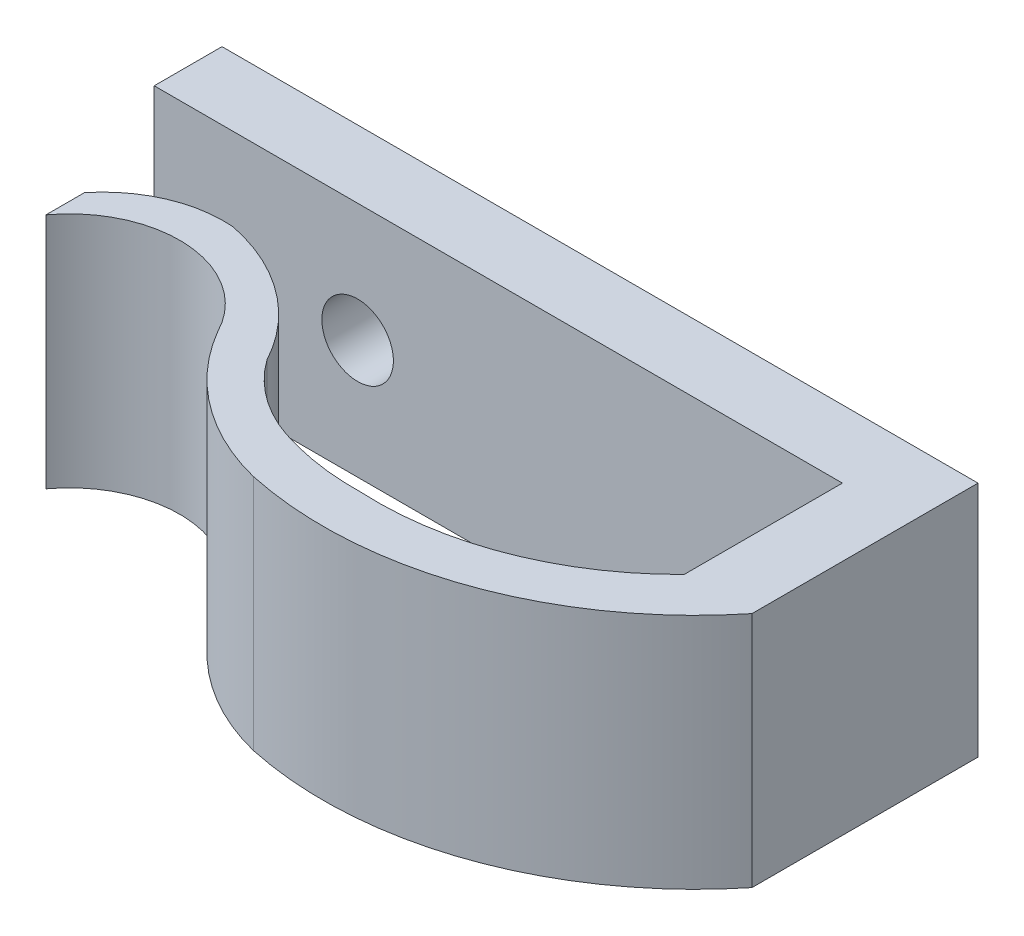
ISO-10303-21;
HEADER;
FILE_DESCRIPTION(('STEP AP214'),'2;1');
FILE_NAME('part.step','',(''),(''),'','','');
FILE_SCHEMA(('AUTOMOTIVE_DESIGN { 1 0 10303 214 1 1 1 1 }'));
ENDSEC;
DATA;
#1=APPLICATION_CONTEXT('core data for automotive mechanical design processes');
#2=APPLICATION_PROTOCOL_DEFINITION('international standard','automotive_design',2000,#1);
#3=PRODUCT_CONTEXT('',#1,'mechanical');
#4=PRODUCT('Part','Part','',(#3));
#5=PRODUCT_RELATED_PRODUCT_CATEGORY('part','',(#4));
#6=PRODUCT_DEFINITION_FORMATION('','',#4);
#7=PRODUCT_DEFINITION_CONTEXT('part definition',#1,'design');
#8=PRODUCT_DEFINITION('design','',#6,#7);
#9=PRODUCT_DEFINITION_SHAPE('','',#8);
#10=(LENGTH_UNIT() NAMED_UNIT(*) SI_UNIT(.MILLI.,.METRE.));
#11=(NAMED_UNIT(*) PLANE_ANGLE_UNIT() SI_UNIT($,.RADIAN.));
#12=(NAMED_UNIT(*) SI_UNIT($,.STERADIAN.) SOLID_ANGLE_UNIT());
#13=UNCERTAINTY_MEASURE_WITH_UNIT(LENGTH_MEASURE(1.E-05),#10,'distance_accuracy_value','');
#14=(GEOMETRIC_REPRESENTATION_CONTEXT(3) GLOBAL_UNCERTAINTY_ASSIGNED_CONTEXT((#13)) GLOBAL_UNIT_ASSIGNED_CONTEXT((#10,
#11,#12)) REPRESENTATION_CONTEXT('',''));
#15=CARTESIAN_POINT('',(0.,0.,0.));
#16=DIRECTION('',(0.,0.,1.));
#17=DIRECTION('',(1.,0.,0.));
#18=AXIS2_PLACEMENT_3D('',#15,#16,#17);
#19=CARTESIAN_POINT('',(0.,0.,3.));
#20=DIRECTION('',(0.,0.,-1.));
#21=DIRECTION('',(-1.,0.,0.));
#22=AXIS2_PLACEMENT_3D('',#19,#20,#21);
#23=PLANE('',#22);
#24=CARTESIAN_POINT('',(9.,5.25,3.));
#25=DIRECTION('',(0.,0.,-1.));
#26=DIRECTION('',(-1.,0.,0.));
#27=AXIS2_PLACEMENT_3D('',#24,#25,#26);
#28=CIRCLE('',#27,1.5825);
#29=CARTESIAN_POINT('',(7.4175,5.25,3.));
#30=VERTEX_POINT('',#29);
#31=EDGE_CURVE('E187',#30,#30,#28,.F.);
#32=ORIENTED_EDGE('',*,*,#31,.F.);
#33=EDGE_LOOP('',(#32));
#34=FACE_BOUND('',#33,.T.);
#35=DIRECTION('',(0.,-1.,0.));
#36=VECTOR('',#35,1.);
#37=CARTESIAN_POINT('',(30.45,44.0789478894117,3.));
#38=LINE('',#37,#36);
#39=CARTESIAN_POINT('',(30.45,10.5,3.));
#40=VERTEX_POINT('',#39);
#41=CARTESIAN_POINT('',(30.45,0.,3.));
#42=VERTEX_POINT('',#41);
#43=EDGE_CURVE('E50',#40,#42,#38,.T.);
#44=ORIENTED_EDGE('',*,*,#43,.F.);
#45=DIRECTION('',(-1.,0.,0.));
#46=VECTOR('',#45,1.);
#47=CARTESIAN_POINT('',(0.,10.5,3.));
#48=LINE('',#47,#46);
#49=CARTESIAN_POINT('',(0.,10.5,3.));
#50=VERTEX_POINT('',#49);
#51=EDGE_CURVE('E55',#40,#50,#48,.T.);
#52=ORIENTED_EDGE('',*,*,#51,.T.);
#53=DIRECTION('',(0.,-1.,0.));
#54=VECTOR('',#53,1.);
#55=CARTESIAN_POINT('',(0.,0.,3.));
#56=LINE('',#55,#54);
#57=CARTESIAN_POINT('',(0.,0.,3.));
#58=VERTEX_POINT('',#57);
#59=EDGE_CURVE('E86',#50,#58,#56,.T.);
#60=ORIENTED_EDGE('',*,*,#59,.T.);
#61=DIRECTION('',(1.,0.,0.));
#62=VECTOR('',#61,1.);
#63=CARTESIAN_POINT('',(0.,0.,3.));
#64=LINE('',#63,#62);
#65=EDGE_CURVE('E109',#58,#42,#64,.T.);
#66=ORIENTED_EDGE('',*,*,#65,.T.);
#67=EDGE_LOOP('',(#44,#52,#60,#66));
#68=FACE_BOUND('',#67,.T.);
#69=ADVANCED_FACE('F33',(#34,#68),#23,.F.);
#70=CARTESIAN_POINT('',(0.,0.,3.));
#71=DIRECTION('',(1.,0.,0.));
#72=DIRECTION('',(0.,0.,-1.));
#73=AXIS2_PLACEMENT_3D('',#70,#71,#72);
#74=PLANE('',#73);
#75=DIRECTION('',(0.,-1.,0.));
#76=VECTOR('',#75,1.);
#77=CARTESIAN_POINT('',(0.,0.,0.));
#78=LINE('',#77,#76);
#79=CARTESIAN_POINT('',(0.,10.5,0.));
#80=VERTEX_POINT('',#79);
#81=CARTESIAN_POINT('',(0.,0.,0.));
#82=VERTEX_POINT('',#81);
#83=EDGE_CURVE('E92',#80,#82,#78,.T.);
#84=ORIENTED_EDGE('',*,*,#83,.T.);
#85=DIRECTION('',(0.,0.,-1.));
#86=VECTOR('',#85,1.);
#87=CARTESIAN_POINT('',(0.,0.,3.));
#88=LINE('',#87,#86);
#89=EDGE_CURVE('E11',#58,#82,#88,.T.);
#90=ORIENTED_EDGE('',*,*,#89,.F.);
#91=ORIENTED_EDGE('',*,*,#59,.F.);
#92=DIRECTION('',(0.,0.,-1.));
#93=VECTOR('',#92,1.);
#94=CARTESIAN_POINT('',(0.,10.5,3.));
#95=LINE('',#94,#93);
#96=EDGE_CURVE('E78',#50,#80,#95,.T.);
#97=ORIENTED_EDGE('',*,*,#96,.T.);
#98=EDGE_LOOP('',(#84,#90,#91,#97));
#99=FACE_BOUND('',#98,.T.);
#100=ADVANCED_FACE('F35',(#99),#74,.F.);
#101=CARTESIAN_POINT('',(0.,0.,3.));
#102=DIRECTION('',(0.,1.,0.));
#103=DIRECTION('',(0.,0.,1.));
#104=AXIS2_PLACEMENT_3D('',#101,#102,#103);
#105=PLANE('',#104);
#106=DIRECTION('',(1.,0.,0.));
#107=VECTOR('',#106,1.);
#108=CARTESIAN_POINT('',(0.,0.,0.));
#109=LINE('',#108,#107);
#110=CARTESIAN_POINT('',(33.45,0.,0.));
#111=VERTEX_POINT('',#110);
#112=EDGE_CURVE('E95',#82,#111,#109,.T.);
#113=ORIENTED_EDGE('',*,*,#112,.T.);
#114=DIRECTION('',(0.,0.,-1.));
#115=VECTOR('',#114,1.);
#116=CARTESIAN_POINT('',(33.45,0.,3.));
#117=LINE('',#116,#115);
#118=CARTESIAN_POINT('',(33.45,0.,10.));
#119=VERTEX_POINT('',#118);
#120=EDGE_CURVE('E42',#119,#111,#117,.T.);
#121=ORIENTED_EDGE('',*,*,#120,.F.);
#122=CARTESIAN_POINT('',(20.6221159544795,0.,-0.315248646860587));
#123=DIRECTION('',(0.,-1.,0.));
#124=DIRECTION('',(0.,0.,1.));
#125=AXIS2_PLACEMENT_3D('',#122,#123,#124);
#126=CIRCLE('',#125,16.4608311980859);
#127=CARTESIAN_POINT('',(17.1672552114183,0.,15.7789397756084));
#128=VERTEX_POINT('',#127);
#129=EDGE_CURVE('E184',#119,#128,#126,.T.);
#130=ORIENTED_EDGE('',*,*,#129,.T.);
#131=CARTESIAN_POINT('',(19.6516591254384,0.,5.86713389302404));
#132=DIRECTION('',(0.,-1.,0.));
#133=DIRECTION('',(0.,0.,1.));
#134=AXIS2_PLACEMENT_3D('',#131,#132,#133);
#135=CIRCLE('',#134,10.2184225133839);
#136=CARTESIAN_POINT('',(10.8227065112487,0.,11.011621661347));
#137=VERTEX_POINT('',#136);
#138=EDGE_CURVE('E181',#128,#137,#135,.T.);
#139=ORIENTED_EDGE('',*,*,#138,.T.);
#140=CARTESIAN_POINT('',(6.47932166353078,0.,13.2291650625122));
#141=DIRECTION('',(0.,1.,0.));
#142=DIRECTION('',(0.,0.,-1.));
#143=AXIS2_PLACEMENT_3D('',#140,#141,#142);
#144=CIRCLE('',#143,4.8767295056664);
#145=CARTESIAN_POINT('',(2.55114240382426,0.,10.3391999459323));
#146=VERTEX_POINT('',#145);
#147=EDGE_CURVE('E178',#137,#146,#144,.T.);
#148=ORIENTED_EDGE('',*,*,#147,.T.);
#149=DIRECTION('',(0.,0.,-1.));
#150=VECTOR('',#149,1.);
#151=CARTESIAN_POINT('',(2.55114240382426,0.,8.63919994593232));
#152=LINE('',#151,#150);
#153=CARTESIAN_POINT('',(2.55114240382426,0.,8.63919994593232));
#154=VERTEX_POINT('',#153);
#155=EDGE_CURVE('E175',#146,#154,#152,.T.);
#156=ORIENTED_EDGE('',*,*,#155,.T.);
#157=CARTESIAN_POINT('',(6.72229219411145,0.,11.9958869329718));
#158=DIRECTION('',(0.,-1.,0.));
#159=DIRECTION('',(0.,0.,1.));
#160=AXIS2_PLACEMENT_3D('',#157,#158,#159);
#161=CIRCLE('',#160,5.35404875790023);
#162=CARTESIAN_POINT('',(7.14595265795709,0.,6.65862640781967));
#163=VERTEX_POINT('',#162);
#164=EDGE_CURVE('E172',#154,#163,#161,.T.);
#165=ORIENTED_EDGE('',*,*,#164,.T.);
#166=CARTESIAN_POINT('',(5.45521227568022,0.,15.0432902360127));
#167=DIRECTION('',(0.,-1.,0.));
#168=DIRECTION('',(0.,0.,-1.));
#169=AXIS2_PLACEMENT_3D('',#166,#167,#168);
#170=CIRCLE('',#169,8.55343150741679);
#171=CARTESIAN_POINT('',(12.9988744537025,0.,11.011621661347));
#172=VERTEX_POINT('',#171);
#173=EDGE_CURVE('E167',#163,#172,#170,.T.);
#174=ORIENTED_EDGE('',*,*,#173,.T.);
#175=CARTESIAN_POINT('',(18.4056741869957,0.,7.11561574984572));
#176=DIRECTION('',(0.,1.,0.));
#177=DIRECTION('',(0.,0.,1.));
#178=AXIS2_PLACEMENT_3D('',#175,#176,#177);
#179=CIRCLE('',#178,6.66425880487787);
#180=CARTESIAN_POINT('',(16.2592047181273,0.,13.4247372606115));
#181=VERTEX_POINT('',#180);
#182=EDGE_CURVE('E163',#172,#181,#179,.T.);
#183=ORIENTED_EDGE('',*,*,#182,.T.);
#184=CARTESIAN_POINT('',(19.8885488525217,0.,2.33177145979925));
#185=DIRECTION('',(0.,1.,0.));
#186=DIRECTION('',(0.,0.,1.));
#187=AXIS2_PLACEMENT_3D('',#184,#185,#186);
#188=CIRCLE('',#187,11.6715906843863);
#189=CARTESIAN_POINT('',(20.1686771043971,0.,14.));
#190=VERTEX_POINT('',#189);
#191=EDGE_CURVE('E159',#181,#190,#188,.T.);
#192=ORIENTED_EDGE('',*,*,#191,.T.);
#193=CARTESIAN_POINT('',(20.8749114107498,0.,0.602055675435018));
#194=DIRECTION('',(0.,1.,0.));
#195=DIRECTION('',(0.,0.,1.));
#196=AXIS2_PLACEMENT_3D('',#193,#194,#195);
#197=CIRCLE('',#196,13.4165449732639);
#198=CARTESIAN_POINT('',(30.45,0.,10.));
#199=VERTEX_POINT('',#198);
#200=EDGE_CURVE('E148',#190,#199,#197,.T.);
#201=ORIENTED_EDGE('',*,*,#200,.T.);
#202=DIRECTION('',(0.,0.,-1.));
#203=VECTOR('',#202,1.);
#204=CARTESIAN_POINT('',(30.45,0.,3.));
#205=LINE('',#204,#203);
#206=EDGE_CURVE('E119',#199,#42,#205,.T.);
#207=ORIENTED_EDGE('',*,*,#206,.T.);
#208=ORIENTED_EDGE('',*,*,#65,.F.);
#209=ORIENTED_EDGE('',*,*,#89,.T.);
#210=EDGE_LOOP('',(#113,#121,#130,#139,#148,#156,#165,#174,#183,#192,#201,#207,#208,#209));
#211=FACE_BOUND('',#210,.T.);
#212=ADVANCED_FACE('F225',(#211),#105,.F.);
#213=CARTESIAN_POINT('',(33.45,0.,3.));
#214=DIRECTION('',(-1.,0.,0.));
#215=DIRECTION('',(0.,0.,1.));
#216=AXIS2_PLACEMENT_3D('',#213,#214,#215);
#217=PLANE('',#216);
#218=DIRECTION('',(0.,1.,0.));
#219=VECTOR('',#218,1.);
#220=CARTESIAN_POINT('',(33.45,0.,0.));
#221=LINE('',#220,#219);
#222=CARTESIAN_POINT('',(33.45,10.5,0.));
#223=VERTEX_POINT('',#222);
#224=EDGE_CURVE('E87',#111,#223,#221,.T.);
#225=ORIENTED_EDGE('',*,*,#224,.T.);
#226=DIRECTION('',(0.,0.,-1.));
#227=VECTOR('',#226,1.);
#228=CARTESIAN_POINT('',(33.45,10.5,3.));
#229=LINE('',#228,#227);
#230=CARTESIAN_POINT('',(33.45,10.5,10.));
#231=VERTEX_POINT('',#230);
#232=EDGE_CURVE('E82',#231,#223,#229,.T.);
#233=ORIENTED_EDGE('',*,*,#232,.F.);
#234=DIRECTION('',(0.,-1.,0.));
#235=VECTOR('',#234,1.);
#236=CARTESIAN_POINT('',(33.45,44.0789478894117,10.));
#237=LINE('',#236,#235);
#238=EDGE_CURVE('E115',#231,#119,#237,.T.);
#239=ORIENTED_EDGE('',*,*,#238,.T.);
#240=ORIENTED_EDGE('',*,*,#120,.T.);
#241=EDGE_LOOP('',(#225,#233,#239,#240));
#242=FACE_BOUND('',#241,.T.);
#243=ADVANCED_FACE('F236',(#242),#217,.F.);
#244=CARTESIAN_POINT('',(0.,10.5,3.));
#245=DIRECTION('',(0.,-1.,0.));
#246=DIRECTION('',(0.,0.,-1.));
#247=AXIS2_PLACEMENT_3D('',#244,#245,#246);
#248=PLANE('',#247);
#249=DIRECTION('',(-1.,0.,0.));
#250=VECTOR('',#249,1.);
#251=CARTESIAN_POINT('',(0.,10.5,0.));
#252=LINE('',#251,#250);
#253=EDGE_CURVE('E75',#223,#80,#252,.T.);
#254=ORIENTED_EDGE('',*,*,#253,.T.);
#255=ORIENTED_EDGE('',*,*,#96,.F.);
#256=ORIENTED_EDGE('',*,*,#51,.F.);
#257=DIRECTION('',(0.,0.,1.));
#258=VECTOR('',#257,1.);
#259=CARTESIAN_POINT('',(30.45,10.5,3.));
#260=LINE('',#259,#258);
#261=CARTESIAN_POINT('',(30.45,10.5,10.));
#262=VERTEX_POINT('',#261);
#263=EDGE_CURVE('E96',#40,#262,#260,.T.);
#264=ORIENTED_EDGE('',*,*,#263,.T.);
#265=CARTESIAN_POINT('',(20.8749114107498,10.5,0.602055675435018));
#266=DIRECTION('',(0.,-1.,0.));
#267=DIRECTION('',(0.,0.,-1.));
#268=AXIS2_PLACEMENT_3D('',#265,#266,#267);
#269=CIRCLE('',#268,13.4165449732639);
#270=CARTESIAN_POINT('',(20.1686771043971,10.5,14.));
#271=VERTEX_POINT('',#270);
#272=EDGE_CURVE('E100',#262,#271,#269,.T.);
#273=ORIENTED_EDGE('',*,*,#272,.T.);
#274=CARTESIAN_POINT('',(19.8885488525217,10.5,2.33177145979925));
#275=DIRECTION('',(0.,-1.,0.));
#276=DIRECTION('',(0.,0.,-1.));
#277=AXIS2_PLACEMENT_3D('',#274,#275,#276);
#278=CIRCLE('',#277,11.6715906843863);
#279=CARTESIAN_POINT('',(16.2592047181273,10.5,13.4247372606115));
#280=VERTEX_POINT('',#279);
#281=EDGE_CURVE('E190',#271,#280,#278,.T.);
#282=ORIENTED_EDGE('',*,*,#281,.T.);
#283=CARTESIAN_POINT('',(18.4056741869957,10.5,7.11561574984572));
#284=DIRECTION('',(0.,-1.,0.));
#285=DIRECTION('',(0.,0.,-1.));
#286=AXIS2_PLACEMENT_3D('',#283,#284,#285);
#287=CIRCLE('',#286,6.66425880487787);
#288=CARTESIAN_POINT('',(12.9988744537025,10.5,11.011621661347));
#289=VERTEX_POINT('',#288);
#290=EDGE_CURVE('E193',#280,#289,#287,.T.);
#291=ORIENTED_EDGE('',*,*,#290,.T.);
#292=CARTESIAN_POINT('',(5.45521227568022,10.5,15.0432902360127));
#293=DIRECTION('',(0.,-1.,0.));
#294=DIRECTION('',(0.,0.,-1.));
#295=AXIS2_PLACEMENT_3D('',#292,#293,#294);
#296=CIRCLE('',#295,8.55343150741679);
#297=CARTESIAN_POINT('',(7.14595265795709,10.5,6.65862640781967));
#298=VERTEX_POINT('',#297);
#299=EDGE_CURVE('E196',#289,#298,#296,.F.);
#300=ORIENTED_EDGE('',*,*,#299,.T.);
#301=CARTESIAN_POINT('',(6.72229219411145,10.5,11.9958869329718));
#302=DIRECTION('',(0.,-1.,0.));
#303=DIRECTION('',(0.,0.,-1.));
#304=AXIS2_PLACEMENT_3D('',#301,#302,#303);
#305=CIRCLE('',#304,5.35404875790023);
#306=CARTESIAN_POINT('',(2.55114240382426,10.5,8.63919994593232));
#307=VERTEX_POINT('',#306);
#308=EDGE_CURVE('E199',#298,#307,#305,.F.);
#309=ORIENTED_EDGE('',*,*,#308,.T.);
#310=DIRECTION('',(0.,0.,1.));
#311=VECTOR('',#310,1.);
#312=CARTESIAN_POINT('',(2.55114240382426,10.5,8.63919994593232));
#313=LINE('',#312,#311);
#314=CARTESIAN_POINT('',(2.55114240382426,10.5,10.3391999459323));
#315=VERTEX_POINT('',#314);
#316=EDGE_CURVE('E202',#307,#315,#313,.T.);
#317=ORIENTED_EDGE('',*,*,#316,.T.);
#318=CARTESIAN_POINT('',(6.47932166353078,10.5,13.2291650625122));
#319=DIRECTION('',(0.,-1.,0.));
#320=DIRECTION('',(0.,0.,-1.));
#321=AXIS2_PLACEMENT_3D('',#318,#319,#320);
#322=CIRCLE('',#321,4.8767295056664);
#323=CARTESIAN_POINT('',(10.8227065112487,10.5,11.011621661347));
#324=VERTEX_POINT('',#323);
#325=EDGE_CURVE('E205',#315,#324,#322,.T.);
#326=ORIENTED_EDGE('',*,*,#325,.T.);
#327=CARTESIAN_POINT('',(19.6516591254384,10.5,5.86713389302404));
#328=DIRECTION('',(0.,-1.,0.));
#329=DIRECTION('',(0.,0.,-1.));
#330=AXIS2_PLACEMENT_3D('',#327,#328,#329);
#331=CIRCLE('',#330,10.2184225133839);
#332=CARTESIAN_POINT('',(17.1672552114183,10.5,15.7789397756084));
#333=VERTEX_POINT('',#332);
#334=EDGE_CURVE('E208',#324,#333,#331,.F.);
#335=ORIENTED_EDGE('',*,*,#334,.T.);
#336=CARTESIAN_POINT('',(20.6221159544795,10.5,-0.315248646860587));
#337=DIRECTION('',(0.,-1.,0.));
#338=DIRECTION('',(0.,0.,-1.));
#339=AXIS2_PLACEMENT_3D('',#336,#337,#338);
#340=CIRCLE('',#339,16.4608311980859);
#341=EDGE_CURVE('E151',#333,#231,#340,.F.);
#342=ORIENTED_EDGE('',*,*,#341,.T.);
#343=ORIENTED_EDGE('',*,*,#232,.T.);
#344=EDGE_LOOP('',(#254,#255,#256,#264,#273,#282,#291,#300,#309,#317,#326,#335,#342,#343));
#345=FACE_BOUND('',#344,.T.);
#346=ADVANCED_FACE('F77',(#345),#248,.F.);
#347=CARTESIAN_POINT('',(0.,0.,0.));
#348=DIRECTION('',(0.,0.,-1.));
#349=DIRECTION('',(-1.,0.,0.));
#350=AXIS2_PLACEMENT_3D('',#347,#348,#349);
#351=PLANE('',#350);
#352=CARTESIAN_POINT('',(9.,5.25,0.));
#353=DIRECTION('',(0.,0.,-1.));
#354=DIRECTION('',(-1.,0.,0.));
#355=AXIS2_PLACEMENT_3D('',#352,#353,#354);
#356=CIRCLE('',#355,1.5825);
#357=CARTESIAN_POINT('',(7.4175,5.25,0.));
#358=VERTEX_POINT('',#357);
#359=EDGE_CURVE('E212',#358,#358,#356,.T.);
#360=ORIENTED_EDGE('',*,*,#359,.F.);
#361=EDGE_LOOP('',(#360));
#362=FACE_BOUND('',#361,.T.);
#363=ORIENTED_EDGE('',*,*,#83,.F.);
#364=ORIENTED_EDGE('',*,*,#253,.F.);
#365=ORIENTED_EDGE('',*,*,#224,.F.);
#366=ORIENTED_EDGE('',*,*,#112,.F.);
#367=EDGE_LOOP('',(#363,#364,#365,#366));
#368=FACE_BOUND('',#367,.T.);
#369=ADVANCED_FACE('F94',(#362,#368),#351,.T.);
#370=CARTESIAN_POINT('',(30.45,44.0789478894117,3.));
#371=DIRECTION('',(-1.,0.,0.));
#372=DIRECTION('',(0.,0.,1.));
#373=AXIS2_PLACEMENT_3D('',#370,#371,#372);
#374=PLANE('',#373);
#375=ORIENTED_EDGE('',*,*,#263,.F.);
#376=ORIENTED_EDGE('',*,*,#43,.T.);
#377=ORIENTED_EDGE('',*,*,#206,.F.);
#378=DIRECTION('',(0.,-1.,0.));
#379=VECTOR('',#378,1.);
#380=CARTESIAN_POINT('',(30.45,44.0789478894117,10.));
#381=LINE('',#380,#379);
#382=EDGE_CURVE('E143',#262,#199,#381,.T.);
#383=ORIENTED_EDGE('',*,*,#382,.F.);
#384=EDGE_LOOP('',(#375,#376,#377,#383));
#385=FACE_BOUND('',#384,.T.);
#386=ADVANCED_FACE('F232',(#385),#374,.T.);
#387=CARTESIAN_POINT('',(20.8749114107498,44.0789478894117,0.602055675435018));
#388=DIRECTION('',(0.,-1.,0.));
#389=DIRECTION('',(0.,0.,-1.));
#390=AXIS2_PLACEMENT_3D('',#387,#388,#389);
#391=CYLINDRICAL_SURFACE('',#390,13.4165449732639);
#392=ORIENTED_EDGE('',*,*,#272,.F.);
#393=ORIENTED_EDGE('',*,*,#382,.T.);
#394=ORIENTED_EDGE('',*,*,#200,.F.);
#395=DIRECTION('',(0.,-1.,0.));
#396=VECTOR('',#395,1.);
#397=CARTESIAN_POINT('',(20.1686771043971,44.0789478894117,14.));
#398=LINE('',#397,#396);
#399=EDGE_CURVE('E140',#271,#190,#398,.T.);
#400=ORIENTED_EDGE('',*,*,#399,.F.);
#401=EDGE_LOOP('',(#392,#393,#394,#400));
#402=FACE_BOUND('',#401,.T.);
#403=ADVANCED_FACE('F321',(#402),#391,.F.);
#404=CARTESIAN_POINT('',(19.8885488525217,44.0789478894117,2.33177145979925));
#405=DIRECTION('',(0.,-1.,0.));
#406=DIRECTION('',(0.,0.,-1.));
#407=AXIS2_PLACEMENT_3D('',#404,#405,#406);
#408=CYLINDRICAL_SURFACE('',#407,11.6715906843863);
#409=ORIENTED_EDGE('',*,*,#281,.F.);
#410=ORIENTED_EDGE('',*,*,#399,.T.);
#411=ORIENTED_EDGE('',*,*,#191,.F.);
#412=DIRECTION('',(0.,-1.,0.));
#413=VECTOR('',#412,1.);
#414=CARTESIAN_POINT('',(16.2592047181273,44.0789478894117,13.4247372606115));
#415=LINE('',#414,#413);
#416=EDGE_CURVE('E137',#280,#181,#415,.T.);
#417=ORIENTED_EDGE('',*,*,#416,.F.);
#418=EDGE_LOOP('',(#409,#410,#411,#417));
#419=FACE_BOUND('',#418,.T.);
#420=ADVANCED_FACE('F317',(#419),#408,.F.);
#421=CARTESIAN_POINT('',(18.4056741869957,44.0789478894117,7.11561574984572));
#422=DIRECTION('',(0.,-1.,0.));
#423=DIRECTION('',(0.,0.,-1.));
#424=AXIS2_PLACEMENT_3D('',#421,#422,#423);
#425=CYLINDRICAL_SURFACE('',#424,6.66425880487787);
#426=ORIENTED_EDGE('',*,*,#290,.F.);
#427=ORIENTED_EDGE('',*,*,#416,.T.);
#428=ORIENTED_EDGE('',*,*,#182,.F.);
#429=DIRECTION('',(0.,-1.,0.));
#430=VECTOR('',#429,1.);
#431=CARTESIAN_POINT('',(12.9988744537025,44.0789478894117,11.011621661347));
#432=LINE('',#431,#430);
#433=EDGE_CURVE('E134',#289,#172,#432,.T.);
#434=ORIENTED_EDGE('',*,*,#433,.F.);
#435=EDGE_LOOP('',(#426,#427,#428,#434));
#436=FACE_BOUND('',#435,.T.);
#437=ADVANCED_FACE('F313',(#436),#425,.F.);
#438=CARTESIAN_POINT('',(5.45521227568022,44.0789478894117,15.0432902360127));
#439=DIRECTION('',(0.,-1.,0.));
#440=DIRECTION('',(0.,0.,-1.));
#441=AXIS2_PLACEMENT_3D('',#438,#439,#440);
#442=CYLINDRICAL_SURFACE('',#441,8.55343150741679);
#443=ORIENTED_EDGE('',*,*,#299,.F.);
#444=ORIENTED_EDGE('',*,*,#433,.T.);
#445=ORIENTED_EDGE('',*,*,#173,.F.);
#446=DIRECTION('',(0.,-1.,0.));
#447=VECTOR('',#446,1.);
#448=CARTESIAN_POINT('',(7.14595265795709,44.0789478894117,6.65862640781967));
#449=LINE('',#448,#447);
#450=EDGE_CURVE('E131',#298,#163,#449,.T.);
#451=ORIENTED_EDGE('',*,*,#450,.F.);
#452=EDGE_LOOP('',(#443,#444,#445,#451));
#453=FACE_BOUND('',#452,.T.);
#454=ADVANCED_FACE('F308',(#453),#442,.T.);
#455=CARTESIAN_POINT('',(6.72229219411145,44.0789478894117,11.9958869329718));
#456=DIRECTION('',(0.,-1.,0.));
#457=DIRECTION('',(0.,0.,-1.));
#458=AXIS2_PLACEMENT_3D('',#455,#456,#457);
#459=CYLINDRICAL_SURFACE('',#458,5.35404875790023);
#460=ORIENTED_EDGE('',*,*,#308,.F.);
#461=ORIENTED_EDGE('',*,*,#450,.T.);
#462=ORIENTED_EDGE('',*,*,#164,.F.);
#463=DIRECTION('',(0.,-1.,0.));
#464=VECTOR('',#463,1.);
#465=CARTESIAN_POINT('',(2.55114240382426,44.0789478894117,8.63919994593232));
#466=LINE('',#465,#464);
#467=EDGE_CURVE('E128',#307,#154,#466,.T.);
#468=ORIENTED_EDGE('',*,*,#467,.F.);
#469=EDGE_LOOP('',(#460,#461,#462,#468));
#470=FACE_BOUND('',#469,.T.);
#471=ADVANCED_FACE('F303',(#470),#459,.T.);
#472=CARTESIAN_POINT('',(2.55114240382426,44.0789478894117,8.63919994593232));
#473=DIRECTION('',(-1.,0.,0.));
#474=DIRECTION('',(0.,0.,1.));
#475=AXIS2_PLACEMENT_3D('',#472,#473,#474);
#476=PLANE('',#475);
#477=ORIENTED_EDGE('',*,*,#316,.F.);
#478=ORIENTED_EDGE('',*,*,#467,.T.);
#479=ORIENTED_EDGE('',*,*,#155,.F.);
#480=DIRECTION('',(0.,-1.,0.));
#481=VECTOR('',#480,1.);
#482=CARTESIAN_POINT('',(2.55114240382426,44.0789478894117,10.3391999459323));
#483=LINE('',#482,#481);
#484=EDGE_CURVE('E125',#315,#146,#483,.T.);
#485=ORIENTED_EDGE('',*,*,#484,.F.);
#486=EDGE_LOOP('',(#477,#478,#479,#485));
#487=FACE_BOUND('',#486,.T.);
#488=ADVANCED_FACE('F299',(#487),#476,.T.);
#489=CARTESIAN_POINT('',(6.47932166353078,44.0789478894117,13.2291650625122));
#490=DIRECTION('',(0.,-1.,0.));
#491=DIRECTION('',(0.,0.,-1.));
#492=AXIS2_PLACEMENT_3D('',#489,#490,#491);
#493=CYLINDRICAL_SURFACE('',#492,4.8767295056664);
#494=ORIENTED_EDGE('',*,*,#325,.F.);
#495=ORIENTED_EDGE('',*,*,#484,.T.);
#496=ORIENTED_EDGE('',*,*,#147,.F.);
#497=DIRECTION('',(0.,-1.,0.));
#498=VECTOR('',#497,1.);
#499=CARTESIAN_POINT('',(10.8227065112487,44.0789478894117,11.011621661347));
#500=LINE('',#499,#498);
#501=EDGE_CURVE('E122',#324,#137,#500,.T.);
#502=ORIENTED_EDGE('',*,*,#501,.F.);
#503=EDGE_LOOP('',(#494,#495,#496,#502));
#504=FACE_BOUND('',#503,.T.);
#505=ADVANCED_FACE('F293',(#504),#493,.F.);
#506=CARTESIAN_POINT('',(19.6516591254384,44.0789478894117,5.86713389302404));
#507=DIRECTION('',(0.,-1.,0.));
#508=DIRECTION('',(0.,0.,-1.));
#509=AXIS2_PLACEMENT_3D('',#506,#507,#508);
#510=CYLINDRICAL_SURFACE('',#509,10.2184225133839);
#511=ORIENTED_EDGE('',*,*,#334,.F.);
#512=ORIENTED_EDGE('',*,*,#501,.T.);
#513=ORIENTED_EDGE('',*,*,#138,.F.);
#514=DIRECTION('',(0.,-1.,0.));
#515=VECTOR('',#514,1.);
#516=CARTESIAN_POINT('',(17.1672552114183,44.0789478894117,15.7789397756084));
#517=LINE('',#516,#515);
#518=EDGE_CURVE('E118',#333,#128,#517,.T.);
#519=ORIENTED_EDGE('',*,*,#518,.F.);
#520=EDGE_LOOP('',(#511,#512,#513,#519));
#521=FACE_BOUND('',#520,.T.);
#522=ADVANCED_FACE('F290',(#521),#510,.T.);
#523=CARTESIAN_POINT('',(20.6221159544795,44.0789478894117,-0.315248646860587));
#524=DIRECTION('',(0.,-1.,0.));
#525=DIRECTION('',(0.,0.,-1.));
#526=AXIS2_PLACEMENT_3D('',#523,#524,#525);
#527=CYLINDRICAL_SURFACE('',#526,16.4608311980859);
#528=ORIENTED_EDGE('',*,*,#341,.F.);
#529=ORIENTED_EDGE('',*,*,#518,.T.);
#530=ORIENTED_EDGE('',*,*,#129,.F.);
#531=ORIENTED_EDGE('',*,*,#238,.F.);
#532=EDGE_LOOP('',(#528,#529,#530,#531));
#533=FACE_BOUND('',#532,.T.);
#534=ADVANCED_FACE('F228',(#533),#527,.T.);
#535=CARTESIAN_POINT('',(9.,5.25,16.1465825512253));
#536=DIRECTION('',(0.,0.,-1.));
#537=DIRECTION('',(-1.,0.,0.));
#538=AXIS2_PLACEMENT_3D('',#535,#536,#537);
#539=CYLINDRICAL_SURFACE('',#538,1.5825);
#540=ORIENTED_EDGE('',*,*,#359,.T.);
#541=EDGE_LOOP('',(#540));
#542=FACE_BOUND('',#541,.T.);
#543=ORIENTED_EDGE('',*,*,#31,.T.);
#544=EDGE_LOOP('',(#543));
#545=FACE_BOUND('',#544,.T.);
#546=ADVANCED_FACE('F218',(#542,#545),#539,.F.);
#547=CLOSED_SHELL('',(#69,#100,#212,#243,#346,#369,#386,#403,#420,#437,#454,#471,#488,#505,#522,
#534,#546));
#548=MANIFOLD_SOLID_BREP('B2',#547);
#549=ADVANCED_BREP_SHAPE_REPRESENTATION('',(#18,#548),#14);
#550=SHAPE_DEFINITION_REPRESENTATION(#9,#549);
ENDSEC;
END-ISO-10303-21;
